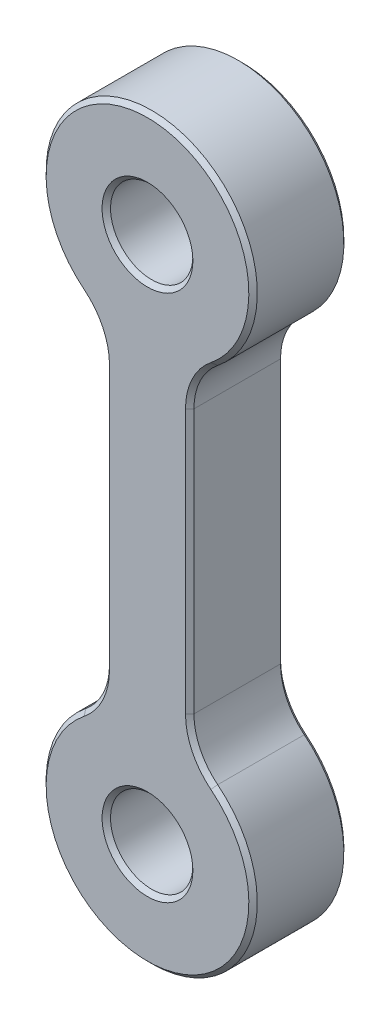
ISO-10303-21;
HEADER;
FILE_DESCRIPTION(('STEP AP214'),'2;1');
FILE_NAME('part.step','',(''),(''),'','','');
FILE_SCHEMA(('AUTOMOTIVE_DESIGN { 1 0 10303 214 1 1 1 1 }'));
ENDSEC;
DATA;
#1=APPLICATION_CONTEXT('core data for automotive mechanical design processes');
#2=APPLICATION_PROTOCOL_DEFINITION('international standard','automotive_design',2000,#1);
#3=PRODUCT_CONTEXT('',#1,'mechanical');
#4=PRODUCT('Part','Part','',(#3));
#5=PRODUCT_RELATED_PRODUCT_CATEGORY('part','',(#4));
#6=PRODUCT_DEFINITION_FORMATION('','',#4);
#7=PRODUCT_DEFINITION_CONTEXT('part definition',#1,'design');
#8=PRODUCT_DEFINITION('design','',#6,#7);
#9=PRODUCT_DEFINITION_SHAPE('','',#8);
#10=(LENGTH_UNIT() NAMED_UNIT(*) SI_UNIT(.MILLI.,.METRE.));
#11=(NAMED_UNIT(*) PLANE_ANGLE_UNIT() SI_UNIT($,.RADIAN.));
#12=(NAMED_UNIT(*) SI_UNIT($,.STERADIAN.) SOLID_ANGLE_UNIT());
#13=UNCERTAINTY_MEASURE_WITH_UNIT(LENGTH_MEASURE(1.E-05),#10,'distance_accuracy_value','');
#14=(GEOMETRIC_REPRESENTATION_CONTEXT(3) GLOBAL_UNCERTAINTY_ASSIGNED_CONTEXT((#13)) GLOBAL_UNIT_ASSIGNED_CONTEXT((#10,
#11,#12)) REPRESENTATION_CONTEXT('',''));
#15=CARTESIAN_POINT('',(0.,0.,0.));
#16=DIRECTION('',(0.,0.,1.));
#17=DIRECTION('',(1.,0.,0.));
#18=AXIS2_PLACEMENT_3D('',#15,#16,#17);
#19=CARTESIAN_POINT('',(0.,12.5,4.5));
#20=DIRECTION('',(0.,0.,1.));
#21=DIRECTION('',(1.,0.,0.));
#22=AXIS2_PLACEMENT_3D('',#19,#20,#21);
#23=PLANE('',#22);
#24=CARTESIAN_POINT('',(0.,-12.5,4.5));
#25=DIRECTION('',(0.,0.,1.));
#26=DIRECTION('',(1.,0.,0.));
#27=AXIS2_PLACEMENT_3D('',#24,#25,#26);
#28=CIRCLE('',#27,2.15);
#29=CARTESIAN_POINT('',(2.15,-12.5,4.5));
#30=VERTEX_POINT('',#29);
#31=EDGE_CURVE('E11',#30,#30,#28,.F.);
#32=ORIENTED_EDGE('',*,*,#31,.T.);
#33=EDGE_LOOP('',(#32));
#34=FACE_BOUND('',#33,.T.);
#35=CARTESIAN_POINT('',(0.,12.5,4.5));
#36=DIRECTION('',(0.,0.,1.));
#37=DIRECTION('',(1.,0.,0.));
#38=AXIS2_PLACEMENT_3D('',#35,#36,#37);
#39=CIRCLE('',#38,2.15);
#40=CARTESIAN_POINT('',(2.15,12.5,4.5));
#41=VERTEX_POINT('',#40);
#42=EDGE_CURVE('E27',#41,#41,#39,.F.);
#43=ORIENTED_EDGE('',*,*,#42,.T.);
#44=EDGE_LOOP('',(#43));
#45=FACE_BOUND('',#44,.T.);
#46=CARTESIAN_POINT('',(0.,-12.5,4.5));
#47=DIRECTION('',(0.,0.,1.));
#48=DIRECTION('',(1.,0.,0.));
#49=AXIS2_PLACEMENT_3D('',#46,#47,#48);
#50=CIRCLE('',#49,4.8);
#51=CARTESIAN_POINT('',(-3.,-8.75300120096096,4.5));
#52=VERTEX_POINT('',#51);
#53=CARTESIAN_POINT('',(3.,-8.75300120096096,4.5));
#54=VERTEX_POINT('',#53);
#55=EDGE_CURVE('E35',#52,#54,#50,.T.);
#56=ORIENTED_EDGE('',*,*,#55,.T.);
#57=CARTESIAN_POINT('',(5.,-6.25500200160161,4.5));
#58=DIRECTION('',(0.,0.,1.));
#59=DIRECTION('',(1.,0.,0.));
#60=AXIS2_PLACEMENT_3D('',#57,#58,#59);
#61=CIRCLE('',#60,3.2);
#62=CARTESIAN_POINT('',(1.8,-6.25500200160161,4.5));
#63=VERTEX_POINT('',#62);
#64=EDGE_CURVE('E226',#54,#63,#61,.F.);
#65=ORIENTED_EDGE('',*,*,#64,.T.);
#66=DIRECTION('',(0.,1.,0.));
#67=VECTOR('',#66,1.);
#68=CARTESIAN_POINT('',(1.8,6.25500200160161,4.5));
#69=LINE('',#68,#67);
#70=CARTESIAN_POINT('',(1.8,6.25500200160161,4.5));
#71=VERTEX_POINT('',#70);
#72=EDGE_CURVE('E214',#63,#71,#69,.T.);
#73=ORIENTED_EDGE('',*,*,#72,.T.);
#74=CARTESIAN_POINT('',(5.,6.25500200160161,4.5));
#75=DIRECTION('',(0.,0.,1.));
#76=DIRECTION('',(1.,0.,0.));
#77=AXIS2_PLACEMENT_3D('',#74,#75,#76);
#78=CIRCLE('',#77,3.2);
#79=CARTESIAN_POINT('',(3.,8.75300120096096,4.5));
#80=VERTEX_POINT('',#79);
#81=EDGE_CURVE('E216',#71,#80,#78,.F.);
#82=ORIENTED_EDGE('',*,*,#81,.T.);
#83=CARTESIAN_POINT('',(0.,12.5,4.5));
#84=DIRECTION('',(0.,0.,1.));
#85=DIRECTION('',(1.,0.,0.));
#86=AXIS2_PLACEMENT_3D('',#83,#84,#85);
#87=CIRCLE('',#86,4.8);
#88=CARTESIAN_POINT('',(-3.,8.75300120096096,4.5));
#89=VERTEX_POINT('',#88);
#90=EDGE_CURVE('E218',#80,#89,#87,.T.);
#91=ORIENTED_EDGE('',*,*,#90,.T.);
#92=CARTESIAN_POINT('',(-5.,6.2550020016016,4.5));
#93=DIRECTION('',(0.,0.,1.));
#94=DIRECTION('',(1.,0.,0.));
#95=AXIS2_PLACEMENT_3D('',#92,#93,#94);
#96=CIRCLE('',#95,3.2);
#97=CARTESIAN_POINT('',(-1.8,6.2550020016016,4.5));
#98=VERTEX_POINT('',#97);
#99=EDGE_CURVE('E220',#89,#98,#96,.F.);
#100=ORIENTED_EDGE('',*,*,#99,.T.);
#101=DIRECTION('',(0.,-1.,0.));
#102=VECTOR('',#101,1.);
#103=CARTESIAN_POINT('',(-1.8,-6.2550020016016,4.5));
#104=LINE('',#103,#102);
#105=CARTESIAN_POINT('',(-1.8,-6.2550020016016,4.5));
#106=VERTEX_POINT('',#105);
#107=EDGE_CURVE('E222',#98,#106,#104,.T.);
#108=ORIENTED_EDGE('',*,*,#107,.T.);
#109=CARTESIAN_POINT('',(-5.,-6.2550020016016,4.5));
#110=DIRECTION('',(0.,0.,1.));
#111=DIRECTION('',(1.,0.,0.));
#112=AXIS2_PLACEMENT_3D('',#109,#110,#111);
#113=CIRCLE('',#112,3.2);
#114=EDGE_CURVE('E40',#106,#52,#113,.F.);
#115=ORIENTED_EDGE('',*,*,#114,.T.);
#116=EDGE_LOOP('',(#56,#65,#73,#82,#91,#100,#108,#115));
#117=FACE_BOUND('',#116,.T.);
#118=ADVANCED_FACE('F17',(#34,#45,#117),#23,.T.);
#119=CARTESIAN_POINT('',(0.,12.5,0.));
#120=DIRECTION('',(0.,0.,1.));
#121=DIRECTION('',(1.,0.,0.));
#122=AXIS2_PLACEMENT_3D('',#119,#120,#121);
#123=PLANE('',#122);
#124=CARTESIAN_POINT('',(0.,-12.5,0.));
#125=DIRECTION('',(0.,0.,1.));
#126=DIRECTION('',(1.,0.,0.));
#127=AXIS2_PLACEMENT_3D('',#124,#125,#126);
#128=CIRCLE('',#127,2.15);
#129=CARTESIAN_POINT('',(2.15,-12.5,0.));
#130=VERTEX_POINT('',#129);
#131=EDGE_CURVE('E162',#130,#130,#128,.T.);
#132=ORIENTED_EDGE('',*,*,#131,.T.);
#133=EDGE_LOOP('',(#132));
#134=FACE_BOUND('',#133,.T.);
#135=CARTESIAN_POINT('',(0.,12.5,0.));
#136=DIRECTION('',(0.,0.,1.));
#137=DIRECTION('',(1.,0.,0.));
#138=AXIS2_PLACEMENT_3D('',#135,#136,#137);
#139=CIRCLE('',#138,2.15);
#140=CARTESIAN_POINT('',(2.15,12.5,0.));
#141=VERTEX_POINT('',#140);
#142=EDGE_CURVE('E159',#141,#141,#139,.T.);
#143=ORIENTED_EDGE('',*,*,#142,.T.);
#144=EDGE_LOOP('',(#143));
#145=FACE_BOUND('',#144,.T.);
#146=CARTESIAN_POINT('',(0.,-12.5,0.));
#147=DIRECTION('',(0.,0.,1.));
#148=DIRECTION('',(1.,0.,0.));
#149=AXIS2_PLACEMENT_3D('',#146,#147,#148);
#150=CIRCLE('',#149,4.8);
#151=CARTESIAN_POINT('',(3.,-8.75300120096097,0.));
#152=VERTEX_POINT('',#151);
#153=CARTESIAN_POINT('',(-3.,-8.75300120096097,0.));
#154=VERTEX_POINT('',#153);
#155=EDGE_CURVE('E157',#152,#154,#150,.F.);
#156=ORIENTED_EDGE('',*,*,#155,.T.);
#157=CARTESIAN_POINT('',(-5.,-6.2550020016016,0.));
#158=DIRECTION('',(0.,0.,1.));
#159=DIRECTION('',(1.,0.,0.));
#160=AXIS2_PLACEMENT_3D('',#157,#158,#159);
#161=CIRCLE('',#160,3.2);
#162=CARTESIAN_POINT('',(-1.8,-6.2550020016016,0.));
#163=VERTEX_POINT('',#162);
#164=EDGE_CURVE('E138',#154,#163,#161,.T.);
#165=ORIENTED_EDGE('',*,*,#164,.T.);
#166=DIRECTION('',(0.,1.,0.));
#167=VECTOR('',#166,1.);
#168=CARTESIAN_POINT('',(-1.8,12.5,0.));
#169=LINE('',#168,#167);
#170=CARTESIAN_POINT('',(-1.8,6.2550020016016,0.));
#171=VERTEX_POINT('',#170);
#172=EDGE_CURVE('E146',#163,#171,#169,.T.);
#173=ORIENTED_EDGE('',*,*,#172,.T.);
#174=CARTESIAN_POINT('',(-5.,6.2550020016016,0.));
#175=DIRECTION('',(0.,0.,1.));
#176=DIRECTION('',(1.,0.,0.));
#177=AXIS2_PLACEMENT_3D('',#174,#175,#176);
#178=CIRCLE('',#177,3.2);
#179=CARTESIAN_POINT('',(-3.,8.75300120096097,0.));
#180=VERTEX_POINT('',#179);
#181=EDGE_CURVE('E152',#171,#180,#178,.T.);
#182=ORIENTED_EDGE('',*,*,#181,.T.);
#183=CARTESIAN_POINT('',(0.,12.5,0.));
#184=DIRECTION('',(0.,0.,1.));
#185=DIRECTION('',(1.,0.,0.));
#186=AXIS2_PLACEMENT_3D('',#183,#184,#185);
#187=CIRCLE('',#186,4.8);
#188=CARTESIAN_POINT('',(3.,8.75300120096097,0.));
#189=VERTEX_POINT('',#188);
#190=EDGE_CURVE('E312',#180,#189,#187,.F.);
#191=ORIENTED_EDGE('',*,*,#190,.T.);
#192=CARTESIAN_POINT('',(5.,6.25500200160161,0.));
#193=DIRECTION('',(0.,0.,1.));
#194=DIRECTION('',(1.,0.,0.));
#195=AXIS2_PLACEMENT_3D('',#192,#193,#194);
#196=CIRCLE('',#195,3.2);
#197=CARTESIAN_POINT('',(1.8,6.25500200160161,0.));
#198=VERTEX_POINT('',#197);
#199=EDGE_CURVE('E314',#189,#198,#196,.T.);
#200=ORIENTED_EDGE('',*,*,#199,.T.);
#201=DIRECTION('',(0.,-1.,0.));
#202=VECTOR('',#201,1.);
#203=CARTESIAN_POINT('',(1.8,12.5,0.));
#204=LINE('',#203,#202);
#205=CARTESIAN_POINT('',(1.8,-6.25500200160161,0.));
#206=VERTEX_POINT('',#205);
#207=EDGE_CURVE('E316',#198,#206,#204,.T.);
#208=ORIENTED_EDGE('',*,*,#207,.T.);
#209=CARTESIAN_POINT('',(5.,-6.25500200160161,0.));
#210=DIRECTION('',(0.,0.,1.));
#211=DIRECTION('',(1.,0.,0.));
#212=AXIS2_PLACEMENT_3D('',#209,#210,#211);
#213=CIRCLE('',#212,3.2);
#214=EDGE_CURVE('E164',#206,#152,#213,.T.);
#215=ORIENTED_EDGE('',*,*,#214,.T.);
#216=EDGE_LOOP('',(#156,#165,#173,#182,#191,#200,#208,#215));
#217=FACE_BOUND('',#216,.T.);
#218=ADVANCED_FACE('F155',(#134,#145,#217),#123,.F.);
#219=CARTESIAN_POINT('',(0.,12.5,4.5));
#220=DIRECTION('',(0.,0.,-1.));
#221=DIRECTION('',(-1.,0.,0.));
#222=AXIS2_PLACEMENT_3D('',#219,#220,#221);
#223=CYLINDRICAL_SURFACE('',#222,5.);
#224=DIRECTION('',(0.,0.,-1.));
#225=VECTOR('',#224,1.);
#226=CARTESIAN_POINT('',(3.125,8.59687625100101,4.5));
#227=LINE('',#226,#225);
#228=CARTESIAN_POINT('',(3.125,8.59687625100101,4.3));
#229=VERTEX_POINT('',#228);
#230=CARTESIAN_POINT('',(3.125,8.59687625100101,0.200000000000006));
#231=VERTEX_POINT('',#230);
#232=EDGE_CURVE('E292',#229,#231,#227,.T.);
#233=ORIENTED_EDGE('',*,*,#232,.T.);
#234=CARTESIAN_POINT('',(0.,12.5,0.200000000000006));
#235=DIRECTION('',(0.,0.,1.));
#236=DIRECTION('',(1.,0.,0.));
#237=AXIS2_PLACEMENT_3D('',#234,#235,#236);
#238=CIRCLE('',#237,5.);
#239=CARTESIAN_POINT('',(-3.125,8.596876251001,0.200000000000006));
#240=VERTEX_POINT('',#239);
#241=EDGE_CURVE('E204',#231,#240,#238,.T.);
#242=ORIENTED_EDGE('',*,*,#241,.T.);
#243=DIRECTION('',(0.,0.,-1.));
#244=VECTOR('',#243,1.);
#245=CARTESIAN_POINT('',(-3.125,8.596876251001,4.5));
#246=LINE('',#245,#244);
#247=CARTESIAN_POINT('',(-3.125,8.596876251001,4.3));
#248=VERTEX_POINT('',#247);
#249=EDGE_CURVE('E247',#240,#248,#246,.F.);
#250=ORIENTED_EDGE('',*,*,#249,.T.);
#251=CARTESIAN_POINT('',(0.,12.5,4.3));
#252=DIRECTION('',(0.,0.,1.));
#253=DIRECTION('',(1.,0.,0.));
#254=AXIS2_PLACEMENT_3D('',#251,#252,#253);
#255=CIRCLE('',#254,5.);
#256=EDGE_CURVE('E202',#248,#229,#255,.F.);
#257=ORIENTED_EDGE('',*,*,#256,.T.);
#258=EDGE_LOOP('',(#233,#242,#250,#257));
#259=FACE_BOUND('',#258,.T.);
#260=ADVANCED_FACE('F289',(#259),#223,.T.);
#261=CARTESIAN_POINT('',(0.,-12.5,4.5));
#262=DIRECTION('',(0.,0.,-1.));
#263=DIRECTION('',(-1.,0.,0.));
#264=AXIS2_PLACEMENT_3D('',#261,#262,#263);
#265=CYLINDRICAL_SURFACE('',#264,5.);
#266=DIRECTION('',(0.,0.,-1.));
#267=VECTOR('',#266,1.);
#268=CARTESIAN_POINT('',(-3.125,-8.596876251001,4.5));
#269=LINE('',#268,#267);
#270=CARTESIAN_POINT('',(-3.125,-8.596876251001,4.3));
#271=VERTEX_POINT('',#270);
#272=CARTESIAN_POINT('',(-3.125,-8.596876251001,0.200000000000006));
#273=VERTEX_POINT('',#272);
#274=EDGE_CURVE('E302',#271,#273,#269,.T.);
#275=ORIENTED_EDGE('',*,*,#274,.T.);
#276=CARTESIAN_POINT('',(0.,-12.5,0.200000000000006));
#277=DIRECTION('',(0.,0.,1.));
#278=DIRECTION('',(1.,0.,0.));
#279=AXIS2_PLACEMENT_3D('',#276,#277,#278);
#280=CIRCLE('',#279,5.);
#281=CARTESIAN_POINT('',(3.125,-8.59687625100101,0.200000000000006));
#282=VERTEX_POINT('',#281);
#283=EDGE_CURVE('E187',#273,#282,#280,.T.);
#284=ORIENTED_EDGE('',*,*,#283,.T.);
#285=DIRECTION('',(0.,0.,-1.));
#286=VECTOR('',#285,1.);
#287=CARTESIAN_POINT('',(3.125,-8.59687625100101,4.5));
#288=LINE('',#287,#286);
#289=CARTESIAN_POINT('',(3.125,-8.59687625100101,4.3));
#290=VERTEX_POINT('',#289);
#291=EDGE_CURVE('E305',#282,#290,#288,.F.);
#292=ORIENTED_EDGE('',*,*,#291,.T.);
#293=CARTESIAN_POINT('',(0.,-12.5,4.3));
#294=DIRECTION('',(0.,0.,1.));
#295=DIRECTION('',(1.,0.,0.));
#296=AXIS2_PLACEMENT_3D('',#293,#294,#295);
#297=CIRCLE('',#296,5.);
#298=EDGE_CURVE('E185',#290,#271,#297,.F.);
#299=ORIENTED_EDGE('',*,*,#298,.T.);
#300=EDGE_LOOP('',(#275,#284,#292,#299));
#301=FACE_BOUND('',#300,.T.);
#302=ADVANCED_FACE('F334',(#301),#265,.T.);
#303=CARTESIAN_POINT('',(0.,12.5,4.5));
#304=DIRECTION('',(0.,0.,-1.));
#305=DIRECTION('',(-1.,0.,0.));
#306=AXIS2_PLACEMENT_3D('',#303,#304,#305);
#307=CYLINDRICAL_SURFACE('',#306,1.95);
#308=CARTESIAN_POINT('',(0.,12.5,0.199999999999992));
#309=DIRECTION('',(0.,0.,1.));
#310=DIRECTION('',(1.,0.,0.));
#311=AXIS2_PLACEMENT_3D('',#308,#309,#310);
#312=CIRCLE('',#311,1.95);
#313=CARTESIAN_POINT('',(1.95,12.5,0.199999999999992));
#314=VERTEX_POINT('',#313);
#315=EDGE_CURVE('E179',#314,#314,#312,.F.);
#316=ORIENTED_EDGE('',*,*,#315,.T.);
#317=EDGE_LOOP('',(#316));
#318=FACE_BOUND('',#317,.T.);
#319=CARTESIAN_POINT('',(0.,12.5,4.3));
#320=DIRECTION('',(0.,0.,1.));
#321=DIRECTION('',(1.,0.,0.));
#322=AXIS2_PLACEMENT_3D('',#319,#320,#321);
#323=CIRCLE('',#322,1.95);
#324=CARTESIAN_POINT('',(1.95,12.5,4.3));
#325=VERTEX_POINT('',#324);
#326=EDGE_CURVE('E176',#325,#325,#323,.T.);
#327=ORIENTED_EDGE('',*,*,#326,.T.);
#328=EDGE_LOOP('',(#327));
#329=FACE_BOUND('',#328,.T.);
#330=ADVANCED_FACE('F364',(#318,#329),#307,.F.);
#331=CARTESIAN_POINT('',(0.,-12.5,4.5));
#332=DIRECTION('',(0.,0.,-1.));
#333=DIRECTION('',(-1.,0.,0.));
#334=AXIS2_PLACEMENT_3D('',#331,#332,#333);
#335=CYLINDRICAL_SURFACE('',#334,1.95);
#336=CARTESIAN_POINT('',(0.,-12.5,0.199999999999992));
#337=DIRECTION('',(0.,0.,1.));
#338=DIRECTION('',(1.,0.,0.));
#339=AXIS2_PLACEMENT_3D('',#336,#337,#338);
#340=CIRCLE('',#339,1.95);
#341=CARTESIAN_POINT('',(1.95,-12.5,0.199999999999992));
#342=VERTEX_POINT('',#341);
#343=EDGE_CURVE('E173',#342,#342,#340,.F.);
#344=ORIENTED_EDGE('',*,*,#343,.T.);
#345=EDGE_LOOP('',(#344));
#346=FACE_BOUND('',#345,.T.);
#347=CARTESIAN_POINT('',(0.,-12.5,4.3));
#348=DIRECTION('',(0.,0.,1.));
#349=DIRECTION('',(1.,0.,0.));
#350=AXIS2_PLACEMENT_3D('',#347,#348,#349);
#351=CIRCLE('',#350,1.95);
#352=CARTESIAN_POINT('',(1.95,-12.5,4.3));
#353=VERTEX_POINT('',#352);
#354=EDGE_CURVE('E170',#353,#353,#351,.T.);
#355=ORIENTED_EDGE('',*,*,#354,.T.);
#356=EDGE_LOOP('',(#355));
#357=FACE_BOUND('',#356,.T.);
#358=ADVANCED_FACE('F603',(#346,#357),#335,.F.);
#359=CARTESIAN_POINT('',(2.,-7.91742430504416,4.5));
#360=DIRECTION('',(-1.,0.,0.));
#361=DIRECTION('',(0.,0.,1.));
#362=AXIS2_PLACEMENT_3D('',#359,#360,#361);
#363=PLANE('',#362);
#364=DIRECTION('',(0.,0.,1.));
#365=VECTOR('',#364,1.);
#366=CARTESIAN_POINT('',(2.,-6.25500200160161,0.));
#367=LINE('',#366,#365);
#368=CARTESIAN_POINT('',(2.,-6.25500200160161,4.3));
#369=VERTEX_POINT('',#368);
#370=CARTESIAN_POINT('',(2.,-6.25500200160161,0.200000000000006));
#371=VERTEX_POINT('',#370);
#372=EDGE_CURVE('E294',#369,#371,#367,.F.);
#373=ORIENTED_EDGE('',*,*,#372,.T.);
#374=DIRECTION('',(0.,1.,0.));
#375=VECTOR('',#374,1.);
#376=CARTESIAN_POINT('',(2.,-7.91742430504416,0.200000000000006));
#377=LINE('',#376,#375);
#378=CARTESIAN_POINT('',(2.,6.25500200160161,0.200000000000006));
#379=VERTEX_POINT('',#378);
#380=EDGE_CURVE('E196',#371,#379,#377,.T.);
#381=ORIENTED_EDGE('',*,*,#380,.T.);
#382=DIRECTION('',(0.,0.,1.));
#383=VECTOR('',#382,1.);
#384=CARTESIAN_POINT('',(2.,6.25500200160161,4.5));
#385=LINE('',#384,#383);
#386=CARTESIAN_POINT('',(2.,6.25500200160161,4.3));
#387=VERTEX_POINT('',#386);
#388=EDGE_CURVE('E299',#379,#387,#385,.T.);
#389=ORIENTED_EDGE('',*,*,#388,.T.);
#390=DIRECTION('',(0.,-1.,0.));
#391=VECTOR('',#390,1.);
#392=CARTESIAN_POINT('',(2.,-6.25500200160161,4.3));
#393=LINE('',#392,#391);
#394=EDGE_CURVE('E194',#387,#369,#393,.T.);
#395=ORIENTED_EDGE('',*,*,#394,.T.);
#396=EDGE_LOOP('',(#373,#381,#389,#395));
#397=FACE_BOUND('',#396,.T.);
#398=ADVANCED_FACE('F594',(#397),#363,.F.);
#399=CARTESIAN_POINT('',(-2.,-7.91742430504416,4.5));
#400=DIRECTION('',(1.,0.,0.));
#401=DIRECTION('',(0.,0.,-1.));
#402=AXIS2_PLACEMENT_3D('',#399,#400,#401);
#403=PLANE('',#402);
#404=DIRECTION('',(0.,0.,1.));
#405=VECTOR('',#404,1.);
#406=CARTESIAN_POINT('',(-2.,6.2550020016016,0.));
#407=LINE('',#406,#405);
#408=CARTESIAN_POINT('',(-2.,6.2550020016016,4.3));
#409=VERTEX_POINT('',#408);
#410=CARTESIAN_POINT('',(-2.,6.2550020016016,0.200000000000006));
#411=VERTEX_POINT('',#410);
#412=EDGE_CURVE('E286',#409,#411,#407,.F.);
#413=ORIENTED_EDGE('',*,*,#412,.T.);
#414=DIRECTION('',(0.,-1.,0.));
#415=VECTOR('',#414,1.);
#416=CARTESIAN_POINT('',(-2.,-7.91742430504416,0.200000000000006));
#417=LINE('',#416,#415);
#418=CARTESIAN_POINT('',(-2.,-6.2550020016016,0.200000000000006));
#419=VERTEX_POINT('',#418);
#420=EDGE_CURVE('E212',#411,#419,#417,.T.);
#421=ORIENTED_EDGE('',*,*,#420,.T.);
#422=DIRECTION('',(0.,0.,1.));
#423=VECTOR('',#422,1.);
#424=CARTESIAN_POINT('',(-2.,-6.2550020016016,4.5));
#425=LINE('',#424,#423);
#426=CARTESIAN_POINT('',(-2.,-6.2550020016016,4.3));
#427=VERTEX_POINT('',#426);
#428=EDGE_CURVE('E153',#419,#427,#425,.T.);
#429=ORIENTED_EDGE('',*,*,#428,.T.);
#430=DIRECTION('',(0.,1.,0.));
#431=VECTOR('',#430,1.);
#432=CARTESIAN_POINT('',(-2.,6.2550020016016,4.3));
#433=LINE('',#432,#431);
#434=EDGE_CURVE('E210',#427,#409,#433,.T.);
#435=ORIENTED_EDGE('',*,*,#434,.T.);
#436=EDGE_LOOP('',(#413,#421,#429,#435));
#437=FACE_BOUND('',#436,.T.);
#438=ADVANCED_FACE('F374',(#437),#403,.F.);
#439=CARTESIAN_POINT('',(5.,6.25500200160161,4.5));
#440=DIRECTION('',(0.,0.,-1.));
#441=DIRECTION('',(-1.,0.,0.));
#442=AXIS2_PLACEMENT_3D('',#439,#440,#441);
#443=CYLINDRICAL_SURFACE('',#442,3.);
#444=ORIENTED_EDGE('',*,*,#388,.F.);
#445=CARTESIAN_POINT('',(5.,6.25500200160161,0.200000000000006));
#446=DIRECTION('',(0.,0.,1.));
#447=DIRECTION('',(1.,0.,0.));
#448=AXIS2_PLACEMENT_3D('',#445,#446,#447);
#449=CIRCLE('',#448,3.);
#450=EDGE_CURVE('E200',#379,#231,#449,.F.);
#451=ORIENTED_EDGE('',*,*,#450,.T.);
#452=ORIENTED_EDGE('',*,*,#232,.F.);
#453=CARTESIAN_POINT('',(5.,6.25500200160161,4.3));
#454=DIRECTION('',(0.,0.,1.));
#455=DIRECTION('',(1.,0.,0.));
#456=AXIS2_PLACEMENT_3D('',#453,#454,#455);
#457=CIRCLE('',#456,3.);
#458=EDGE_CURVE('E198',#229,#387,#457,.T.);
#459=ORIENTED_EDGE('',*,*,#458,.T.);
#460=EDGE_LOOP('',(#444,#451,#452,#459));
#461=FACE_BOUND('',#460,.T.);
#462=ADVANCED_FACE('F371',(#461),#443,.F.);
#463=CARTESIAN_POINT('',(5.,-6.25500200160161,4.5));
#464=DIRECTION('',(0.,0.,-1.));
#465=DIRECTION('',(-1.,0.,0.));
#466=AXIS2_PLACEMENT_3D('',#463,#464,#465);
#467=CYLINDRICAL_SURFACE('',#466,3.);
#468=ORIENTED_EDGE('',*,*,#291,.F.);
#469=CARTESIAN_POINT('',(5.,-6.25500200160161,0.200000000000006));
#470=DIRECTION('',(0.,0.,1.));
#471=DIRECTION('',(1.,0.,0.));
#472=AXIS2_PLACEMENT_3D('',#469,#470,#471);
#473=CIRCLE('',#472,3.);
#474=EDGE_CURVE('E192',#282,#371,#473,.F.);
#475=ORIENTED_EDGE('',*,*,#474,.T.);
#476=ORIENTED_EDGE('',*,*,#372,.F.);
#477=CARTESIAN_POINT('',(5.,-6.25500200160161,4.3));
#478=DIRECTION('',(0.,0.,1.));
#479=DIRECTION('',(1.,0.,0.));
#480=AXIS2_PLACEMENT_3D('',#477,#478,#479);
#481=CIRCLE('',#480,3.);
#482=EDGE_CURVE('E189',#369,#290,#481,.T.);
#483=ORIENTED_EDGE('',*,*,#482,.T.);
#484=EDGE_LOOP('',(#468,#475,#476,#483));
#485=FACE_BOUND('',#484,.T.);
#486=ADVANCED_FACE('F342',(#485),#467,.F.);
#487=CARTESIAN_POINT('',(-5.,-6.2550020016016,4.5));
#488=DIRECTION('',(0.,0.,-1.));
#489=DIRECTION('',(-1.,0.,0.));
#490=AXIS2_PLACEMENT_3D('',#487,#488,#489);
#491=CYLINDRICAL_SURFACE('',#490,3.);
#492=ORIENTED_EDGE('',*,*,#428,.F.);
#493=CARTESIAN_POINT('',(-5.,-6.2550020016016,0.200000000000006));
#494=DIRECTION('',(0.,0.,1.));
#495=DIRECTION('',(1.,0.,0.));
#496=AXIS2_PLACEMENT_3D('',#493,#494,#495);
#497=CIRCLE('',#496,3.);
#498=EDGE_CURVE('E140',#419,#273,#497,.F.);
#499=ORIENTED_EDGE('',*,*,#498,.T.);
#500=ORIENTED_EDGE('',*,*,#274,.F.);
#501=CARTESIAN_POINT('',(-5.,-6.2550020016016,4.3));
#502=DIRECTION('',(0.,0.,1.));
#503=DIRECTION('',(1.,0.,0.));
#504=AXIS2_PLACEMENT_3D('',#501,#502,#503);
#505=CIRCLE('',#504,3.);
#506=EDGE_CURVE('E182',#271,#427,#505,.T.);
#507=ORIENTED_EDGE('',*,*,#506,.T.);
#508=EDGE_LOOP('',(#492,#499,#500,#507));
#509=FACE_BOUND('',#508,.T.);
#510=ADVANCED_FACE('F332',(#509),#491,.F.);
#511=CARTESIAN_POINT('',(-5.,6.2550020016016,4.5));
#512=DIRECTION('',(0.,0.,-1.));
#513=DIRECTION('',(-1.,0.,0.));
#514=AXIS2_PLACEMENT_3D('',#511,#512,#513);
#515=CYLINDRICAL_SURFACE('',#514,3.);
#516=ORIENTED_EDGE('',*,*,#249,.F.);
#517=CARTESIAN_POINT('',(-5.,6.2550020016016,0.200000000000006));
#518=DIRECTION('',(0.,0.,1.));
#519=DIRECTION('',(1.,0.,0.));
#520=AXIS2_PLACEMENT_3D('',#517,#518,#519);
#521=CIRCLE('',#520,3.);
#522=EDGE_CURVE('E208',#240,#411,#521,.F.);
#523=ORIENTED_EDGE('',*,*,#522,.T.);
#524=ORIENTED_EDGE('',*,*,#412,.F.);
#525=CARTESIAN_POINT('',(-5.,6.2550020016016,4.3));
#526=DIRECTION('',(0.,0.,1.));
#527=DIRECTION('',(1.,0.,0.));
#528=AXIS2_PLACEMENT_3D('',#525,#526,#527);
#529=CIRCLE('',#528,3.);
#530=EDGE_CURVE('E206',#409,#248,#529,.T.);
#531=ORIENTED_EDGE('',*,*,#530,.T.);
#532=EDGE_LOOP('',(#516,#523,#524,#531));
#533=FACE_BOUND('',#532,.T.);
#534=ADVANCED_FACE('F283',(#533),#515,.F.);
#535=CARTESIAN_POINT('',(0.,-12.5,0.));
#536=DIRECTION('',(0.,0.,-1.));
#537=DIRECTION('',(-1.,0.,0.));
#538=AXIS2_PLACEMENT_3D('',#535,#536,#537);
#539=CONICAL_SURFACE('',#538,2.15,0.785398163397447);
#540=ORIENTED_EDGE('',*,*,#343,.F.);
#541=EDGE_LOOP('',(#540));
#542=FACE_BOUND('',#541,.T.);
#543=ORIENTED_EDGE('',*,*,#131,.F.);
#544=EDGE_LOOP('',(#543));
#545=FACE_BOUND('',#544,.T.);
#546=ADVANCED_FACE('F382',(#542,#545),#539,.F.);
#547=CARTESIAN_POINT('',(0.,12.5,0.));
#548=DIRECTION('',(0.,0.,-1.));
#549=DIRECTION('',(-1.,0.,0.));
#550=AXIS2_PLACEMENT_3D('',#547,#548,#549);
#551=CONICAL_SURFACE('',#550,2.15,0.785398163397447);
#552=ORIENTED_EDGE('',*,*,#315,.F.);
#553=EDGE_LOOP('',(#552));
#554=FACE_BOUND('',#553,.T.);
#555=ORIENTED_EDGE('',*,*,#142,.F.);
#556=EDGE_LOOP('',(#555));
#557=FACE_BOUND('',#556,.T.);
#558=ADVANCED_FACE('F390',(#554,#557),#551,.F.);
#559=CARTESIAN_POINT('',(5.,6.25500200160161,0.));
#560=DIRECTION('',(0.,0.,-1.));
#561=DIRECTION('',(-1.,0.,0.));
#562=AXIS2_PLACEMENT_3D('',#559,#560,#561);
#563=CONICAL_SURFACE('',#562,3.2,0.785398163397448);
#564=DIRECTION('',(-0.441941738241591,0.551985054145489,-0.707106781186549));
#565=VECTOR('',#564,1.);
#566=CARTESIAN_POINT('',(3.125,8.59687625100101,0.200000000000006));
#567=LINE('',#566,#565);
#568=EDGE_CURVE('E241',#231,#189,#567,.T.);
#569=ORIENTED_EDGE('',*,*,#568,.F.);
#570=ORIENTED_EDGE('',*,*,#450,.F.);
#571=DIRECTION('',(0.707106781186546,0.,0.707106781186549));
#572=VECTOR('',#571,1.);
#573=CARTESIAN_POINT('',(1.8,6.25500200160161,0.));
#574=LINE('',#573,#572);
#575=EDGE_CURVE('E244',#198,#379,#574,.T.);
#576=ORIENTED_EDGE('',*,*,#575,.F.);
#577=ORIENTED_EDGE('',*,*,#199,.F.);
#578=EDGE_LOOP('',(#569,#570,#576,#577));
#579=FACE_BOUND('',#578,.T.);
#580=ADVANCED_FACE('F397',(#579),#563,.F.);
#581=CARTESIAN_POINT('',(2.,-7.91742430504416,0.200000000000006));
#582=DIRECTION('',(-0.707106781186548,0.,0.707106781186548));
#583=DIRECTION('',(0.,1.,0.));
#584=AXIS2_PLACEMENT_3D('',#581,#582,#583);
#585=PLANE('',#584);
#586=ORIENTED_EDGE('',*,*,#575,.T.);
#587=ORIENTED_EDGE('',*,*,#380,.F.);
#588=DIRECTION('',(0.707106781186548,0.,0.707106781186548));
#589=VECTOR('',#588,1.);
#590=CARTESIAN_POINT('',(1.8,-6.25500200160161,0.));
#591=LINE('',#590,#589);
#592=EDGE_CURVE('E238',#206,#371,#591,.T.);
#593=ORIENTED_EDGE('',*,*,#592,.F.);
#594=ORIENTED_EDGE('',*,*,#207,.F.);
#595=EDGE_LOOP('',(#586,#587,#593,#594));
#596=FACE_BOUND('',#595,.T.);
#597=ADVANCED_FACE('F435',(#596),#585,.F.);
#598=CARTESIAN_POINT('',(0.,12.5,0.200000000000006));
#599=DIRECTION('',(0.,0.,1.));
#600=DIRECTION('',(1.,0.,0.));
#601=AXIS2_PLACEMENT_3D('',#598,#599,#600);
#602=CONICAL_SURFACE('',#601,5.,0.785398163397448);
#603=ORIENTED_EDGE('',*,*,#568,.T.);
#604=ORIENTED_EDGE('',*,*,#190,.F.);
#605=DIRECTION('',(0.441941738241593,0.551985054145489,-0.707106781186549));
#606=VECTOR('',#605,1.);
#607=CARTESIAN_POINT('',(-3.125,8.596876251001,0.200000000000006));
#608=LINE('',#607,#606);
#609=EDGE_CURVE('E235',#240,#180,#608,.T.);
#610=ORIENTED_EDGE('',*,*,#609,.F.);
#611=ORIENTED_EDGE('',*,*,#241,.F.);
#612=EDGE_LOOP('',(#603,#604,#610,#611));
#613=FACE_BOUND('',#612,.T.);
#614=ADVANCED_FACE('F429',(#613),#602,.T.);
#615=CARTESIAN_POINT('',(5.,-6.25500200160161,0.));
#616=DIRECTION('',(0.,0.,-1.));
#617=DIRECTION('',(-1.,0.,0.));
#618=AXIS2_PLACEMENT_3D('',#615,#616,#617);
#619=CONICAL_SURFACE('',#618,3.2,0.785398163397448);
#620=ORIENTED_EDGE('',*,*,#592,.T.);
#621=ORIENTED_EDGE('',*,*,#474,.F.);
#622=DIRECTION('',(0.441941738241592,0.551985054145492,0.707106781186546));
#623=VECTOR('',#622,1.);
#624=CARTESIAN_POINT('',(3.,-8.75300120096097,0.));
#625=LINE('',#624,#623);
#626=EDGE_CURVE('E232',#152,#282,#625,.T.);
#627=ORIENTED_EDGE('',*,*,#626,.F.);
#628=ORIENTED_EDGE('',*,*,#214,.F.);
#629=EDGE_LOOP('',(#620,#621,#627,#628));
#630=FACE_BOUND('',#629,.T.);
#631=ADVANCED_FACE('F323',(#630),#619,.F.);
#632=CARTESIAN_POINT('',(-5.,6.2550020016016,0.));
#633=DIRECTION('',(0.,0.,-1.));
#634=DIRECTION('',(-1.,0.,0.));
#635=AXIS2_PLACEMENT_3D('',#632,#633,#634);
#636=CONICAL_SURFACE('',#635,3.2,0.785398163397448);
#637=ORIENTED_EDGE('',*,*,#609,.T.);
#638=ORIENTED_EDGE('',*,*,#181,.F.);
#639=DIRECTION('',(0.707106781186548,0.,-0.707106781186548));
#640=VECTOR('',#639,1.);
#641=CARTESIAN_POINT('',(-2.,6.2550020016016,0.200000000000006));
#642=LINE('',#641,#640);
#643=EDGE_CURVE('E149',#411,#171,#642,.T.);
#644=ORIENTED_EDGE('',*,*,#643,.F.);
#645=ORIENTED_EDGE('',*,*,#522,.F.);
#646=EDGE_LOOP('',(#637,#638,#644,#645));
#647=FACE_BOUND('',#646,.T.);
#648=ADVANCED_FACE('F417',(#647),#636,.F.);
#649=CARTESIAN_POINT('',(0.,-12.5,0.200000000000006));
#650=DIRECTION('',(0.,0.,1.));
#651=DIRECTION('',(1.,0.,0.));
#652=AXIS2_PLACEMENT_3D('',#649,#650,#651);
#653=CONICAL_SURFACE('',#652,5.,0.785398163397448);
#654=ORIENTED_EDGE('',*,*,#626,.T.);
#655=ORIENTED_EDGE('',*,*,#283,.F.);
#656=DIRECTION('',(-0.441941738241589,0.551985054145494,0.707106781186547));
#657=VECTOR('',#656,1.);
#658=CARTESIAN_POINT('',(-3.,-8.75300120096097,0.));
#659=LINE('',#658,#657);
#660=EDGE_CURVE('E143',#154,#273,#659,.T.);
#661=ORIENTED_EDGE('',*,*,#660,.F.);
#662=ORIENTED_EDGE('',*,*,#155,.F.);
#663=EDGE_LOOP('',(#654,#655,#661,#662));
#664=FACE_BOUND('',#663,.T.);
#665=ADVANCED_FACE('F326',(#664),#653,.T.);
#666=CARTESIAN_POINT('',(-2.,-7.91742430504416,0.200000000000006));
#667=DIRECTION('',(0.707106781186548,0.,0.707106781186548));
#668=DIRECTION('',(0.,-1.,0.));
#669=AXIS2_PLACEMENT_3D('',#666,#667,#668);
#670=PLANE('',#669);
#671=ORIENTED_EDGE('',*,*,#643,.T.);
#672=ORIENTED_EDGE('',*,*,#172,.F.);
#673=DIRECTION('',(0.707106781186548,0.,-0.707106781186548));
#674=VECTOR('',#673,1.);
#675=CARTESIAN_POINT('',(-2.,-6.2550020016016,0.200000000000006));
#676=LINE('',#675,#674);
#677=EDGE_CURVE('E134',#419,#163,#676,.T.);
#678=ORIENTED_EDGE('',*,*,#677,.F.);
#679=ORIENTED_EDGE('',*,*,#420,.F.);
#680=EDGE_LOOP('',(#671,#672,#678,#679));
#681=FACE_BOUND('',#680,.T.);
#682=ADVANCED_FACE('F147',(#681),#670,.F.);
#683=CARTESIAN_POINT('',(-5.,-6.2550020016016,0.));
#684=DIRECTION('',(0.,0.,-1.));
#685=DIRECTION('',(-1.,0.,0.));
#686=AXIS2_PLACEMENT_3D('',#683,#684,#685);
#687=CONICAL_SURFACE('',#686,3.2,0.785398163397448);
#688=ORIENTED_EDGE('',*,*,#660,.T.);
#689=ORIENTED_EDGE('',*,*,#498,.F.);
#690=ORIENTED_EDGE('',*,*,#677,.T.);
#691=ORIENTED_EDGE('',*,*,#164,.F.);
#692=EDGE_LOOP('',(#688,#689,#690,#691));
#693=FACE_BOUND('',#692,.T.);
#694=ADVANCED_FACE('F136',(#693),#687,.F.);
#695=CARTESIAN_POINT('',(0.,-12.5,4.3));
#696=DIRECTION('',(0.,0.,1.));
#697=DIRECTION('',(1.,0.,0.));
#698=AXIS2_PLACEMENT_3D('',#695,#696,#697);
#699=CONICAL_SURFACE('',#698,1.95,0.785398163397457);
#700=ORIENTED_EDGE('',*,*,#31,.F.);
#701=EDGE_LOOP('',(#700));
#702=FACE_BOUND('',#701,.T.);
#703=ORIENTED_EDGE('',*,*,#354,.F.);
#704=EDGE_LOOP('',(#703));
#705=FACE_BOUND('',#704,.T.);
#706=ADVANCED_FACE('F406',(#702,#705),#699,.F.);
#707=CARTESIAN_POINT('',(0.,12.5,4.3));
#708=DIRECTION('',(0.,0.,1.));
#709=DIRECTION('',(1.,0.,0.));
#710=AXIS2_PLACEMENT_3D('',#707,#708,#709);
#711=CONICAL_SURFACE('',#710,1.95,0.785398163397457);
#712=ORIENTED_EDGE('',*,*,#42,.F.);
#713=EDGE_LOOP('',(#712));
#714=FACE_BOUND('',#713,.T.);
#715=ORIENTED_EDGE('',*,*,#326,.F.);
#716=EDGE_LOOP('',(#715));
#717=FACE_BOUND('',#716,.T.);
#718=ADVANCED_FACE('F452',(#714,#717),#711,.F.);
#719=CARTESIAN_POINT('',(-5.,6.2550020016016,4.5));
#720=DIRECTION('',(0.,0.,1.));
#721=DIRECTION('',(1.,0.,0.));
#722=AXIS2_PLACEMENT_3D('',#719,#720,#721);
#723=CONICAL_SURFACE('',#722,3.2,0.785398163397448);
#724=DIRECTION('',(0.441941738241592,0.551985054145493,0.707106781186546));
#725=VECTOR('',#724,1.);
#726=CARTESIAN_POINT('',(-3.125,8.596876251001,4.3));
#727=LINE('',#726,#725);
#728=EDGE_CURVE('E263',#248,#89,#727,.T.);
#729=ORIENTED_EDGE('',*,*,#728,.F.);
#730=ORIENTED_EDGE('',*,*,#530,.F.);
#731=DIRECTION('',(-0.707106781186548,0.,-0.707106781186548));
#732=VECTOR('',#731,1.);
#733=CARTESIAN_POINT('',(-1.8,6.2550020016016,4.5));
#734=LINE('',#733,#732);
#735=EDGE_CURVE('E22',#98,#409,#734,.T.);
#736=ORIENTED_EDGE('',*,*,#735,.F.);
#737=ORIENTED_EDGE('',*,*,#99,.F.);
#738=EDGE_LOOP('',(#729,#730,#736,#737));
#739=FACE_BOUND('',#738,.T.);
#740=ADVANCED_FACE('F20',(#739),#723,.F.);
#741=CARTESIAN_POINT('',(-1.8,12.5,4.5));
#742=DIRECTION('',(-0.707106781186548,0.,0.707106781186548));
#743=DIRECTION('',(0.,1.,0.));
#744=AXIS2_PLACEMENT_3D('',#741,#742,#743);
#745=PLANE('',#744);
#746=ORIENTED_EDGE('',*,*,#735,.T.);
#747=ORIENTED_EDGE('',*,*,#434,.F.);
#748=DIRECTION('',(-0.707106781186548,0.,-0.707106781186548));
#749=VECTOR('',#748,1.);
#750=CARTESIAN_POINT('',(-1.8,-6.2550020016016,4.5));
#751=LINE('',#750,#749);
#752=EDGE_CURVE('E261',#106,#427,#751,.T.);
#753=ORIENTED_EDGE('',*,*,#752,.F.);
#754=ORIENTED_EDGE('',*,*,#107,.F.);
#755=EDGE_LOOP('',(#746,#747,#753,#754));
#756=FACE_BOUND('',#755,.T.);
#757=ADVANCED_FACE('F274',(#756),#745,.T.);
#758=CARTESIAN_POINT('',(0.,12.5,4.5));
#759=DIRECTION('',(0.,0.,-1.));
#760=DIRECTION('',(-1.,0.,0.));
#761=AXIS2_PLACEMENT_3D('',#758,#759,#760);
#762=CONICAL_SURFACE('',#761,4.8,0.785398163397448);
#763=ORIENTED_EDGE('',*,*,#728,.T.);
#764=ORIENTED_EDGE('',*,*,#90,.F.);
#765=DIRECTION('',(-0.441941738241592,0.551985054145489,0.707106781186548));
#766=VECTOR('',#765,1.);
#767=CARTESIAN_POINT('',(3.125,8.59687625100101,4.3));
#768=LINE('',#767,#766);
#769=EDGE_CURVE('E258',#229,#80,#768,.T.);
#770=ORIENTED_EDGE('',*,*,#769,.F.);
#771=ORIENTED_EDGE('',*,*,#256,.F.);
#772=EDGE_LOOP('',(#763,#764,#770,#771));
#773=FACE_BOUND('',#772,.T.);
#774=ADVANCED_FACE('F488',(#773),#762,.T.);
#775=CARTESIAN_POINT('',(-5.,-6.2550020016016,4.5));
#776=DIRECTION('',(0.,0.,1.));
#777=DIRECTION('',(1.,0.,0.));
#778=AXIS2_PLACEMENT_3D('',#775,#776,#777);
#779=CONICAL_SURFACE('',#778,3.2,0.78539816339745);
#780=ORIENTED_EDGE('',*,*,#752,.T.);
#781=ORIENTED_EDGE('',*,*,#506,.F.);
#782=DIRECTION('',(-0.441941738241593,0.551985054145493,-0.707106781186545));
#783=VECTOR('',#782,1.);
#784=CARTESIAN_POINT('',(-3.,-8.75300120096096,4.5));
#785=LINE('',#784,#783);
#786=EDGE_CURVE('E255',#52,#271,#785,.T.);
#787=ORIENTED_EDGE('',*,*,#786,.F.);
#788=ORIENTED_EDGE('',*,*,#114,.F.);
#789=EDGE_LOOP('',(#780,#781,#787,#788));
#790=FACE_BOUND('',#789,.T.);
#791=ADVANCED_FACE('F481',(#790),#779,.F.);
#792=CARTESIAN_POINT('',(5.,6.25500200160161,4.5));
#793=DIRECTION('',(0.,0.,1.));
#794=DIRECTION('',(1.,0.,0.));
#795=AXIS2_PLACEMENT_3D('',#792,#793,#794);
#796=CONICAL_SURFACE('',#795,3.2,0.785398163397448);
#797=ORIENTED_EDGE('',*,*,#769,.T.);
#798=ORIENTED_EDGE('',*,*,#81,.F.);
#799=DIRECTION('',(-0.707106781186547,0.,0.707106781186548));
#800=VECTOR('',#799,1.);
#801=CARTESIAN_POINT('',(2.,6.25500200160161,4.3));
#802=LINE('',#801,#800);
#803=EDGE_CURVE('E252',#387,#71,#802,.T.);
#804=ORIENTED_EDGE('',*,*,#803,.F.);
#805=ORIENTED_EDGE('',*,*,#458,.F.);
#806=EDGE_LOOP('',(#797,#798,#804,#805));
#807=FACE_BOUND('',#806,.T.);
#808=ADVANCED_FACE('F475',(#807),#796,.F.);
#809=CARTESIAN_POINT('',(0.,-12.5,4.5));
#810=DIRECTION('',(0.,0.,-1.));
#811=DIRECTION('',(-1.,0.,0.));
#812=AXIS2_PLACEMENT_3D('',#809,#810,#811);
#813=CONICAL_SURFACE('',#812,4.8,0.785398163397448);
#814=ORIENTED_EDGE('',*,*,#786,.T.);
#815=ORIENTED_EDGE('',*,*,#298,.F.);
#816=DIRECTION('',(0.441941738241594,0.551985054145489,-0.707106781186548));
#817=VECTOR('',#816,1.);
#818=CARTESIAN_POINT('',(3.,-8.75300120096096,4.5));
#819=LINE('',#818,#817);
#820=EDGE_CURVE('E250',#54,#290,#819,.T.);
#821=ORIENTED_EDGE('',*,*,#820,.F.);
#822=ORIENTED_EDGE('',*,*,#55,.F.);
#823=EDGE_LOOP('',(#814,#815,#821,#822));
#824=FACE_BOUND('',#823,.T.);
#825=ADVANCED_FACE('F337',(#824),#813,.T.);
#826=CARTESIAN_POINT('',(1.8,12.5,4.5));
#827=DIRECTION('',(0.707106781186548,0.,0.707106781186548));
#828=DIRECTION('',(0.,-1.,0.));
#829=AXIS2_PLACEMENT_3D('',#826,#827,#828);
#830=PLANE('',#829);
#831=ORIENTED_EDGE('',*,*,#803,.T.);
#832=ORIENTED_EDGE('',*,*,#72,.F.);
#833=DIRECTION('',(-0.707106781186548,0.,0.707106781186548));
#834=VECTOR('',#833,1.);
#835=CARTESIAN_POINT('',(2.,-6.25500200160161,4.3));
#836=LINE('',#835,#834);
#837=EDGE_CURVE('E248',#369,#63,#836,.T.);
#838=ORIENTED_EDGE('',*,*,#837,.F.);
#839=ORIENTED_EDGE('',*,*,#394,.F.);
#840=EDGE_LOOP('',(#831,#832,#838,#839));
#841=FACE_BOUND('',#840,.T.);
#842=ADVANCED_FACE('F349',(#841),#830,.T.);
#843=CARTESIAN_POINT('',(5.,-6.25500200160161,4.5));
#844=DIRECTION('',(0.,0.,1.));
#845=DIRECTION('',(1.,0.,0.));
#846=AXIS2_PLACEMENT_3D('',#843,#844,#845);
#847=CONICAL_SURFACE('',#846,3.2,0.785398163397448);
#848=ORIENTED_EDGE('',*,*,#820,.T.);
#849=ORIENTED_EDGE('',*,*,#482,.F.);
#850=ORIENTED_EDGE('',*,*,#837,.T.);
#851=ORIENTED_EDGE('',*,*,#64,.F.);
#852=EDGE_LOOP('',(#848,#849,#850,#851));
#853=FACE_BOUND('',#852,.T.);
#854=ADVANCED_FACE('F345',(#853),#847,.F.);
#855=CLOSED_SHELL('',(#118,#218,#260,#302,#330,#358,#398,#438,#462,#486,#510,#534,#546,#558,
#580,#597,#614,#631,#648,#665,#682,#694,#706,#718,#740,#757,#774,#791,#808,#825,#842,#854));
#856=MANIFOLD_SOLID_BREP('B1',#855);
#857=ADVANCED_BREP_SHAPE_REPRESENTATION('',(#18,#856),#14);
#858=SHAPE_DEFINITION_REPRESENTATION(#9,#857);
ENDSEC;
END-ISO-10303-21;
